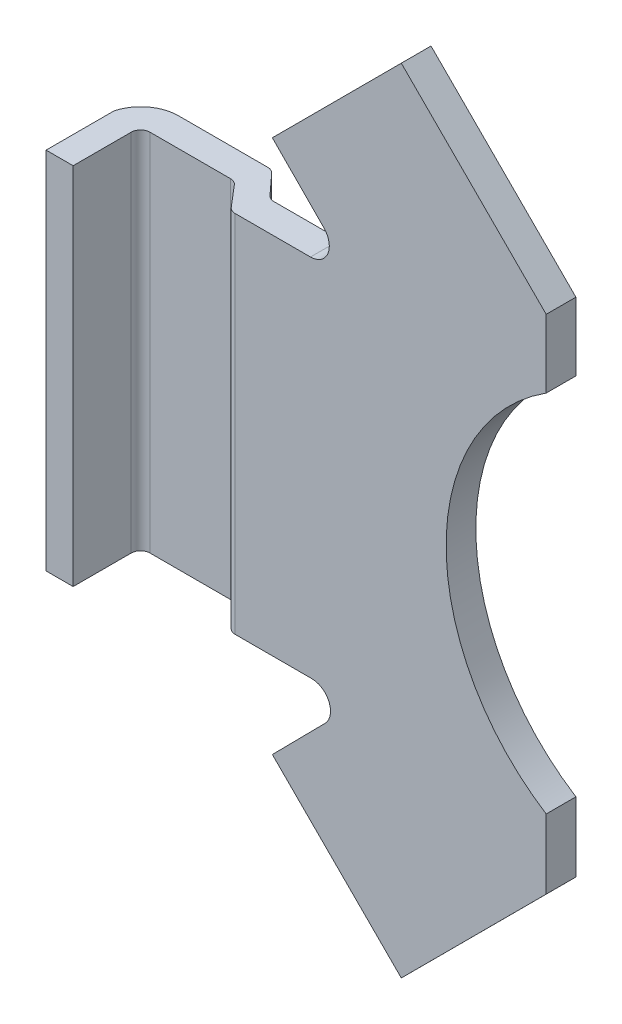
ISO-10303-21;
HEADER;
FILE_DESCRIPTION(('STEP AP214'),'2;1');
FILE_NAME('part.step','',(''),(''),'','','');
FILE_SCHEMA(('AUTOMOTIVE_DESIGN { 1 0 10303 214 1 1 1 1 }'));
ENDSEC;
DATA;
#1=APPLICATION_CONTEXT('core data for automotive mechanical design processes');
#2=APPLICATION_PROTOCOL_DEFINITION('international standard','automotive_design',2000,#1);
#3=PRODUCT_CONTEXT('',#1,'mechanical');
#4=PRODUCT('Part','Part','',(#3));
#5=PRODUCT_RELATED_PRODUCT_CATEGORY('part','',(#4));
#6=PRODUCT_DEFINITION_FORMATION('','',#4);
#7=PRODUCT_DEFINITION_CONTEXT('part definition',#1,'design');
#8=PRODUCT_DEFINITION('design','',#6,#7);
#9=PRODUCT_DEFINITION_SHAPE('','',#8);
#10=(LENGTH_UNIT() NAMED_UNIT(*) SI_UNIT(.MILLI.,.METRE.));
#11=(NAMED_UNIT(*) PLANE_ANGLE_UNIT() SI_UNIT($,.RADIAN.));
#12=(NAMED_UNIT(*) SI_UNIT($,.STERADIAN.) SOLID_ANGLE_UNIT());
#13=UNCERTAINTY_MEASURE_WITH_UNIT(LENGTH_MEASURE(1.E-05),#10,'distance_accuracy_value','');
#14=(GEOMETRIC_REPRESENTATION_CONTEXT(3) GLOBAL_UNCERTAINTY_ASSIGNED_CONTEXT((#13)) GLOBAL_UNIT_ASSIGNED_CONTEXT((#10,
#11,#12)) REPRESENTATION_CONTEXT('',''));
#15=CARTESIAN_POINT('',(0.,0.,0.));
#16=DIRECTION('',(0.,0.,1.));
#17=DIRECTION('',(1.,0.,0.));
#18=AXIS2_PLACEMENT_3D('',#15,#16,#17);
#19=CARTESIAN_POINT('',(-3.06833901407556,-0.000154619924073457,-1.));
#20=DIRECTION('',(-1.,0.,0.));
#21=DIRECTION('',(0.,-1.,0.));
#22=AXIS2_PLACEMENT_3D('',#19,#20,#21);
#23=PLANE('',#22);
#24=DIRECTION('',(0.,1.,0.));
#25=VECTOR('',#24,1.);
#26=CARTESIAN_POINT('',(-3.06833901407556,-4.99999999999999,0.509869098409825));
#27=LINE('',#26,#25);
#28=CARTESIAN_POINT('',(-3.06833901407556,0.968213768723652,0.509869098409825));
#29=VERTEX_POINT('',#28);
#30=CARTESIAN_POINT('',(-3.06833901407556,-0.9685230085718,0.509869098409825));
#31=VERTEX_POINT('',#30);
#32=EDGE_CURVE('E216',#29,#31,#27,.F.);
#33=ORIENTED_EDGE('',*,*,#32,.F.);
#34=DIRECTION('',(0.,0.,1.));
#35=VECTOR('',#34,1.);
#36=CARTESIAN_POINT('',(-3.06833901407556,0.968213768723652,-1.));
#37=LINE('',#36,#35);
#38=CARTESIAN_POINT('',(-3.06833901407556,0.968213768723652,0.149154975526047));
#39=VERTEX_POINT('',#38);
#40=EDGE_CURVE('E141',#29,#39,#37,.F.);
#41=ORIENTED_EDGE('',*,*,#40,.T.);
#42=DIRECTION('',(0.,1.,0.));
#43=VECTOR('',#42,1.);
#44=CARTESIAN_POINT('',(-3.06833901407555,-4.99999999999999,0.149154975526028));
#45=LINE('',#44,#43);
#46=CARTESIAN_POINT('',(-3.06833901407556,-0.9685230085718,0.149154975526047));
#47=VERTEX_POINT('',#46);
#48=EDGE_CURVE('E250',#47,#39,#45,.T.);
#49=ORIENTED_EDGE('',*,*,#48,.F.);
#50=DIRECTION('',(0.,0.,1.));
#51=VECTOR('',#50,1.);
#52=CARTESIAN_POINT('',(-3.06833901407556,-0.9685230085718,-1.));
#53=LINE('',#52,#51);
#54=EDGE_CURVE('E244',#47,#31,#53,.T.);
#55=ORIENTED_EDGE('',*,*,#54,.T.);
#56=EDGE_LOOP('',(#33,#41,#49,#55));
#57=FACE_BOUND('',#56,.T.);
#58=ADVANCED_FACE('F16',(#57),#23,.T.);
#59=CARTESIAN_POINT('',(-2.87491,-4.99999999999999,0.2));
#60=DIRECTION('',(0.,1.,0.));
#61=DIRECTION('',(0.,0.,1.));
#62=AXIS2_PLACEMENT_3D('',#59,#60,#61);
#63=CYLINDRICAL_SURFACE('',#62,0.2);
#64=CARTESIAN_POINT('',(-2.87491,0.968213768723652,0.2));
#65=DIRECTION('',(0.,1.,0.));
#66=DIRECTION('',(0.,0.,1.));
#67=AXIS2_PLACEMENT_3D('',#64,#65,#66);
#68=CIRCLE('',#67,0.2);
#69=CARTESIAN_POINT('',(-2.87491,0.968213768723652,0.));
#70=VERTEX_POINT('',#69);
#71=EDGE_CURVE('E217',#39,#70,#68,.F.);
#72=ORIENTED_EDGE('',*,*,#71,.T.);
#73=DIRECTION('',(0.,1.,0.));
#74=VECTOR('',#73,1.);
#75=CARTESIAN_POINT('',(-2.87491,-4.99999999999999,0.));
#76=LINE('',#75,#74);
#77=CARTESIAN_POINT('',(-2.87491,-0.9685230085718,0.));
#78=VERTEX_POINT('',#77);
#79=EDGE_CURVE('E237',#78,#70,#76,.T.);
#80=ORIENTED_EDGE('',*,*,#79,.F.);
#81=CARTESIAN_POINT('',(-2.87491,-0.9685230085718,0.2));
#82=DIRECTION('',(0.,1.,0.));
#83=DIRECTION('',(0.,0.,1.));
#84=AXIS2_PLACEMENT_3D('',#81,#82,#83);
#85=CIRCLE('',#84,0.2);
#86=EDGE_CURVE('E19',#78,#47,#85,.T.);
#87=ORIENTED_EDGE('',*,*,#86,.T.);
#88=ORIENTED_EDGE('',*,*,#48,.T.);
#89=EDGE_LOOP('',(#72,#80,#87,#88));
#90=FACE_BOUND('',#89,.T.);
#91=ADVANCED_FACE('F308',(#90),#63,.T.);
#92=CARTESIAN_POINT('',(-2.99979074452335,-4.99999999999999,0.509869098409825));
#93=DIRECTION('',(0.,0.,1.));
#94=DIRECTION('',(1.,0.,0.));
#95=AXIS2_PLACEMENT_3D('',#92,#93,#94);
#96=PLANE('',#95);
#97=DIRECTION('',(1.,0.,0.));
#98=VECTOR('',#97,1.);
#99=CARTESIAN_POINT('',(-2.99979074452335,0.968213768723652,0.509869098409825));
#100=LINE('',#99,#98);
#101=CARTESIAN_POINT('',(-2.92467148904669,0.968213768723652,0.509869098409825));
#102=VERTEX_POINT('',#101);
#103=EDGE_CURVE('E193',#102,#29,#100,.F.);
#104=ORIENTED_EDGE('',*,*,#103,.T.);
#105=ORIENTED_EDGE('',*,*,#32,.T.);
#106=DIRECTION('',(1.,0.,0.));
#107=VECTOR('',#106,1.);
#108=CARTESIAN_POINT('',(-2.99979074452335,-0.9685230085718,0.509869098409825));
#109=LINE('',#108,#107);
#110=CARTESIAN_POINT('',(-2.92467148904669,-0.9685230085718,0.509869098409825));
#111=VERTEX_POINT('',#110);
#112=EDGE_CURVE('E200',#31,#111,#109,.T.);
#113=ORIENTED_EDGE('',*,*,#112,.T.);
#114=DIRECTION('',(0.,1.,0.));
#115=VECTOR('',#114,1.);
#116=CARTESIAN_POINT('',(-2.92467148904669,-4.99999999999999,0.509869098409825));
#117=LINE('',#116,#115);
#118=EDGE_CURVE('E214',#102,#111,#117,.F.);
#119=ORIENTED_EDGE('',*,*,#118,.F.);
#120=EDGE_LOOP('',(#104,#105,#113,#119));
#121=FACE_BOUND('',#120,.T.);
#122=ADVANCED_FACE('F213',(#121),#96,.T.);
#123=CARTESIAN_POINT('',(-2.63745267856469,-4.99999999999999,0.));
#124=DIRECTION('',(0.,0.,-1.));
#125=DIRECTION('',(-1.,0.,0.));
#126=AXIS2_PLACEMENT_3D('',#123,#124,#125);
#127=PLANE('',#126);
#128=DIRECTION('',(-1.,0.,0.));
#129=VECTOR('',#128,1.);
#130=CARTESIAN_POINT('',(-2.63745267856469,0.968213768723652,0.));
#131=LINE('',#130,#129);
#132=CARTESIAN_POINT('',(-2.3999953571294,0.968213768723652,0.));
#133=VERTEX_POINT('',#132);
#134=EDGE_CURVE('E209',#70,#133,#131,.F.);
#135=ORIENTED_EDGE('',*,*,#134,.T.);
#136=DIRECTION('',(0.,1.,0.));
#137=VECTOR('',#136,1.);
#138=CARTESIAN_POINT('',(-2.3999953571294,-4.99999999999999,0.));
#139=LINE('',#138,#137);
#140=CARTESIAN_POINT('',(-2.3999953571294,-0.9685230085718,0.));
#141=VERTEX_POINT('',#140);
#142=EDGE_CURVE('E223',#141,#133,#139,.T.);
#143=ORIENTED_EDGE('',*,*,#142,.F.);
#144=DIRECTION('',(-1.,0.,0.));
#145=VECTOR('',#144,1.);
#146=CARTESIAN_POINT('',(-2.63745267856469,-0.9685230085718,0.));
#147=LINE('',#146,#145);
#148=EDGE_CURVE('E228',#141,#78,#147,.T.);
#149=ORIENTED_EDGE('',*,*,#148,.T.);
#150=ORIENTED_EDGE('',*,*,#79,.T.);
#151=EDGE_LOOP('',(#135,#143,#149,#150));
#152=FACE_BOUND('',#151,.T.);
#153=ADVANCED_FACE('F317',(#152),#127,.T.);
#154=CARTESIAN_POINT('',(-2.92467148904669,-4.99999999999999,0.355589549204912));
#155=DIRECTION('',(1.,0.,0.));
#156=DIRECTION('',(0.,0.,-1.));
#157=AXIS2_PLACEMENT_3D('',#154,#155,#156);
#158=PLANE('',#157);
#159=DIRECTION('',(0.,0.,-1.));
#160=VECTOR('',#159,1.);
#161=CARTESIAN_POINT('',(-2.92467148904669,0.968213768723652,0.355589549204912));
#162=LINE('',#161,#160);
#163=CARTESIAN_POINT('',(-2.92467148904671,0.968213768723652,0.20131));
#164=VERTEX_POINT('',#163);
#165=EDGE_CURVE('E208',#164,#102,#162,.F.);
#166=ORIENTED_EDGE('',*,*,#165,.T.);
#167=ORIENTED_EDGE('',*,*,#118,.T.);
#168=DIRECTION('',(0.,0.,-1.));
#169=VECTOR('',#168,1.);
#170=CARTESIAN_POINT('',(-2.92467148904669,-0.9685230085718,0.355589549204912));
#171=LINE('',#170,#169);
#172=CARTESIAN_POINT('',(-2.92467148904671,-0.9685230085718,0.20131));
#173=VERTEX_POINT('',#172);
#174=EDGE_CURVE('E197',#111,#173,#171,.T.);
#175=ORIENTED_EDGE('',*,*,#174,.T.);
#176=DIRECTION('',(0.,1.,0.));
#177=VECTOR('',#176,1.);
#178=CARTESIAN_POINT('',(-2.92467148904672,-4.99999999999999,0.20131));
#179=LINE('',#178,#177);
#180=EDGE_CURVE('E304',#173,#164,#179,.T.);
#181=ORIENTED_EDGE('',*,*,#180,.T.);
#182=EDGE_LOOP('',(#166,#167,#175,#181));
#183=FACE_BOUND('',#182,.T.);
#184=ADVANCED_FACE('F219',(#183),#158,.T.);
#185=CARTESIAN_POINT('',(-2.3999953571294,-4.99999999999999,0.0500000000000007));
#186=DIRECTION('',(0.,1.,0.));
#187=DIRECTION('',(0.,0.,1.));
#188=AXIS2_PLACEMENT_3D('',#185,#186,#187);
#189=CYLINDRICAL_SURFACE('',#188,0.0500000000000007);
#190=CARTESIAN_POINT('',(-2.3999953571294,0.968213768723652,0.0500000000000007));
#191=DIRECTION('',(0.,1.,0.));
#192=DIRECTION('',(0.,0.,1.));
#193=AXIS2_PLACEMENT_3D('',#190,#191,#192);
#194=CIRCLE('',#193,0.0500000000000007);
#195=CARTESIAN_POINT('',(-2.36309722458586,0.968213768723652,0.0162579221920218));
#196=VERTEX_POINT('',#195);
#197=EDGE_CURVE('E305',#133,#196,#194,.F.);
#198=ORIENTED_EDGE('',*,*,#197,.T.);
#199=DIRECTION('',(0.,1.,0.));
#200=VECTOR('',#199,1.);
#201=CARTESIAN_POINT('',(-2.36309722458586,-4.99999999999999,0.016257922192022));
#202=LINE('',#201,#200);
#203=CARTESIAN_POINT('',(-2.36309722458586,-0.9685230085718,0.0162579221920218));
#204=VERTEX_POINT('',#203);
#205=EDGE_CURVE('E323',#204,#196,#202,.T.);
#206=ORIENTED_EDGE('',*,*,#205,.F.);
#207=CARTESIAN_POINT('',(-2.3999953571294,-0.9685230085718,0.0500000000000007));
#208=DIRECTION('',(0.,1.,0.));
#209=DIRECTION('',(0.,0.,1.));
#210=AXIS2_PLACEMENT_3D('',#207,#208,#209);
#211=CIRCLE('',#210,0.0500000000000007);
#212=EDGE_CURVE('E220',#204,#141,#211,.T.);
#213=ORIENTED_EDGE('',*,*,#212,.T.);
#214=ORIENTED_EDGE('',*,*,#142,.T.);
#215=EDGE_LOOP('',(#198,#206,#213,#214));
#216=FACE_BOUND('',#215,.T.);
#217=ADVANCED_FACE('F324',(#216),#189,.T.);
#218=CARTESIAN_POINT('',(-2.87467148904672,-4.99999999999999,0.20131));
#219=DIRECTION('',(0.,1.,0.));
#220=DIRECTION('',(0.,0.,1.));
#221=AXIS2_PLACEMENT_3D('',#218,#219,#220);
#222=CYLINDRICAL_SURFACE('',#221,0.0500000000000007);
#223=DIRECTION('',(0.,1.,0.));
#224=VECTOR('',#223,1.);
#225=CARTESIAN_POINT('',(-2.87467148904672,-4.99999999999999,0.151309999999999));
#226=LINE('',#225,#224);
#227=CARTESIAN_POINT('',(-2.87467148904672,0.968213768723652,0.151309999999999));
#228=VERTEX_POINT('',#227);
#229=CARTESIAN_POINT('',(-2.87467148904672,-0.9685230085718,0.151309999999999));
#230=VERTEX_POINT('',#229);
#231=EDGE_CURVE('E299',#228,#230,#226,.F.);
#232=ORIENTED_EDGE('',*,*,#231,.F.);
#233=CARTESIAN_POINT('',(-2.87467148904672,0.968213768723652,0.20131));
#234=DIRECTION('',(0.,1.,0.));
#235=DIRECTION('',(0.,0.,1.));
#236=AXIS2_PLACEMENT_3D('',#233,#234,#235);
#237=CIRCLE('',#236,0.0500000000000007);
#238=EDGE_CURVE('E302',#164,#228,#237,.F.);
#239=ORIENTED_EDGE('',*,*,#238,.F.);
#240=ORIENTED_EDGE('',*,*,#180,.F.);
#241=CARTESIAN_POINT('',(-2.87467148904672,-0.9685230085718,0.20131));
#242=DIRECTION('',(0.,1.,0.));
#243=DIRECTION('',(0.,0.,1.));
#244=AXIS2_PLACEMENT_3D('',#241,#242,#243);
#245=CIRCLE('',#244,0.0500000000000007);
#246=EDGE_CURVE('E203',#230,#173,#245,.T.);
#247=ORIENTED_EDGE('',*,*,#246,.F.);
#248=EDGE_LOOP('',(#232,#239,#240,#247));
#249=FACE_BOUND('',#248,.T.);
#250=ADVANCED_FACE('F349',(#249),#222,.F.);
#251=CARTESIAN_POINT('',(-2.31328894837563,-4.99999999999999,0.0707250000000001));
#252=DIRECTION('',(0.737962650870705,0.,-0.674841556159579));
#253=DIRECTION('',(-0.674841556159579,0.,-0.737962650870705));
#254=AXIS2_PLACEMENT_3D('',#251,#252,#253);
#255=PLANE('',#254);
#256=DIRECTION('',(-0.674841556159579,0.,-0.737962650870705));
#257=VECTOR('',#256,1.);
#258=CARTESIAN_POINT('',(-2.31328894837563,0.968213768723652,0.0707250000000001));
#259=LINE('',#258,#257);
#260=CARTESIAN_POINT('',(-2.2634806721654,0.968213768723652,0.125192077807979));
#261=VERTEX_POINT('',#260);
#262=EDGE_CURVE('E327',#196,#261,#259,.F.);
#263=ORIENTED_EDGE('',*,*,#262,.T.);
#264=DIRECTION('',(0.,1.,0.));
#265=VECTOR('',#264,1.);
#266=CARTESIAN_POINT('',(-2.2634806721654,-4.99999999999999,0.125192077807979));
#267=LINE('',#266,#265);
#268=CARTESIAN_POINT('',(-2.2634806721654,-0.9685230085718,0.125192077807979));
#269=VERTEX_POINT('',#268);
#270=EDGE_CURVE('E296',#261,#269,#267,.F.);
#271=ORIENTED_EDGE('',*,*,#270,.T.);
#272=DIRECTION('',(-0.674841556159579,0.,-0.737962650870705));
#273=VECTOR('',#272,1.);
#274=CARTESIAN_POINT('',(-2.31328894837563,-0.9685230085718,0.0707250000000001));
#275=LINE('',#274,#273);
#276=EDGE_CURVE('E301',#269,#204,#275,.T.);
#277=ORIENTED_EDGE('',*,*,#276,.T.);
#278=ORIENTED_EDGE('',*,*,#205,.T.);
#279=EDGE_LOOP('',(#263,#271,#277,#278));
#280=FACE_BOUND('',#279,.T.);
#281=ADVANCED_FACE('F329',(#280),#255,.T.);
#282=CARTESIAN_POINT('',(-2.66089729114613,-4.99999999999999,0.151309999999999));
#283=DIRECTION('',(0.,0.,1.));
#284=DIRECTION('',(1.,0.,0.));
#285=AXIS2_PLACEMENT_3D('',#282,#283,#284);
#286=PLANE('',#285);
#287=DIRECTION('',(1.,0.,0.));
#288=VECTOR('',#287,1.);
#289=CARTESIAN_POINT('',(-2.66089729114613,0.968213768723652,0.151309999999999));
#290=LINE('',#289,#288);
#291=CARTESIAN_POINT('',(-2.44712309324554,0.968213768723652,0.151309999999999));
#292=VERTEX_POINT('',#291);
#293=EDGE_CURVE('E339',#292,#228,#290,.F.);
#294=ORIENTED_EDGE('',*,*,#293,.T.);
#295=ORIENTED_EDGE('',*,*,#231,.T.);
#296=DIRECTION('',(1.,0.,0.));
#297=VECTOR('',#296,1.);
#298=CARTESIAN_POINT('',(-2.66089729114613,-0.9685230085718,0.151309999999999));
#299=LINE('',#298,#297);
#300=CARTESIAN_POINT('',(-2.44712309324554,-0.9685230085718,0.151309999999999));
#301=VERTEX_POINT('',#300);
#302=EDGE_CURVE('E337',#230,#301,#299,.T.);
#303=ORIENTED_EDGE('',*,*,#302,.T.);
#304=DIRECTION('',(0.,1.,0.));
#305=VECTOR('',#304,1.);
#306=CARTESIAN_POINT('',(-2.44712309324554,-4.99999999999999,0.151309999999999));
#307=LINE('',#306,#305);
#308=EDGE_CURVE('E293',#301,#292,#307,.T.);
#309=ORIENTED_EDGE('',*,*,#308,.T.);
#310=EDGE_LOOP('',(#294,#295,#303,#309));
#311=FACE_BOUND('',#310,.T.);
#312=ADVANCED_FACE('F356',(#311),#286,.T.);
#313=CARTESIAN_POINT('',(-2.22658253962187,-4.99999999999999,0.0914499999999999));
#314=DIRECTION('',(0.,1.,0.));
#315=DIRECTION('',(0.,0.,1.));
#316=AXIS2_PLACEMENT_3D('',#313,#314,#315);
#317=CYLINDRICAL_SURFACE('',#316,0.0500000000000007);
#318=ORIENTED_EDGE('',*,*,#270,.F.);
#319=CARTESIAN_POINT('',(-2.22658253962187,0.968213768723652,0.0914499999999999));
#320=DIRECTION('',(0.,1.,0.));
#321=DIRECTION('',(0.,0.,1.));
#322=AXIS2_PLACEMENT_3D('',#319,#320,#321);
#323=CIRCLE('',#322,0.0500000000000007);
#324=CARTESIAN_POINT('',(-2.22658253962187,0.968213768723652,0.141450000000001));
#325=VERTEX_POINT('',#324);
#326=EDGE_CURVE('E297',#325,#261,#323,.F.);
#327=ORIENTED_EDGE('',*,*,#326,.F.);
#328=DIRECTION('',(0.,1.,0.));
#329=VECTOR('',#328,1.);
#330=CARTESIAN_POINT('',(-2.22658253962187,-4.99999999999999,0.141450000000001));
#331=LINE('',#330,#329);
#332=CARTESIAN_POINT('',(-2.22658253962187,-0.9685230085718,0.141450000000001));
#333=VERTEX_POINT('',#332);
#334=EDGE_CURVE('E290',#333,#325,#331,.T.);
#335=ORIENTED_EDGE('',*,*,#334,.F.);
#336=CARTESIAN_POINT('',(-2.22658253962187,-0.9685230085718,0.0914499999999999));
#337=DIRECTION('',(0.,1.,0.));
#338=DIRECTION('',(0.,0.,1.));
#339=AXIS2_PLACEMENT_3D('',#336,#337,#338);
#340=CIRCLE('',#339,0.0500000000000007);
#341=EDGE_CURVE('E294',#269,#333,#340,.T.);
#342=ORIENTED_EDGE('',*,*,#341,.F.);
#343=EDGE_LOOP('',(#318,#327,#335,#342));
#344=FACE_BOUND('',#343,.T.);
#345=ADVANCED_FACE('F523',(#344),#317,.F.);
#346=CARTESIAN_POINT('',(-2.44712309324554,-4.99999999999999,0.20131));
#347=DIRECTION('',(0.,1.,0.));
#348=DIRECTION('',(0.,0.,1.));
#349=AXIS2_PLACEMENT_3D('',#346,#347,#348);
#350=CYLINDRICAL_SURFACE('',#349,0.0500000000000009);
#351=DIRECTION('',(0.,1.,0.));
#352=VECTOR('',#351,1.);
#353=CARTESIAN_POINT('',(-2.4091071287639,-4.99999999999999,0.168832524043111));
#354=LINE('',#353,#352);
#355=CARTESIAN_POINT('',(-2.4091071287639,0.968213768723652,0.168832524043112));
#356=VERTEX_POINT('',#355);
#357=CARTESIAN_POINT('',(-2.4091071287639,-0.9685230085718,0.168832524043111));
#358=VERTEX_POINT('',#357);
#359=EDGE_CURVE('E361',#356,#358,#354,.F.);
#360=ORIENTED_EDGE('',*,*,#359,.F.);
#361=CARTESIAN_POINT('',(-2.44712309324554,0.968213768723652,0.20131));
#362=DIRECTION('',(0.,1.,0.));
#363=DIRECTION('',(0.,0.,1.));
#364=AXIS2_PLACEMENT_3D('',#361,#362,#363);
#365=CIRCLE('',#364,0.0500000000000009);
#366=EDGE_CURVE('E291',#292,#356,#365,.F.);
#367=ORIENTED_EDGE('',*,*,#366,.F.);
#368=ORIENTED_EDGE('',*,*,#308,.F.);
#369=CARTESIAN_POINT('',(-2.44712309324554,-0.9685230085718,0.20131));
#370=DIRECTION('',(0.,1.,0.));
#371=DIRECTION('',(0.,0.,1.));
#372=AXIS2_PLACEMENT_3D('',#369,#370,#371);
#373=CIRCLE('',#372,0.0500000000000009);
#374=EDGE_CURVE('E287',#358,#301,#373,.T.);
#375=ORIENTED_EDGE('',*,*,#374,.F.);
#376=EDGE_LOOP('',(#360,#367,#368,#375));
#377=FACE_BOUND('',#376,.T.);
#378=ADVANCED_FACE('F359',(#377),#350,.F.);
#379=CARTESIAN_POINT('',(-1.4178424885196,-4.99999999999999,0.141450000000001));
#380=DIRECTION('',(0.,0.,-1.));
#381=DIRECTION('',(-1.,0.,0.));
#382=AXIS2_PLACEMENT_3D('',#379,#380,#381);
#383=PLANE('',#382);
#384=DIRECTION('',(-0.702621696272423,-0.711563596544443,0.));
#385=VECTOR('',#384,1.);
#386=CARTESIAN_POINT('',(-1.93647797721502,-1.28064062403269,0.141450000000001));
#387=LINE('',#386,#385);
#388=CARTESIAN_POINT('',(-1.79640516508531,-1.13878517819904,0.141450000000001));
#389=VERTEX_POINT('',#388);
#390=CARTESIAN_POINT('',(-2.07655078934474,-1.42249606986633,0.141450000000001));
#391=VERTEX_POINT('',#390);
#392=EDGE_CURVE('E281',#389,#391,#387,.T.);
#393=ORIENTED_EDGE('',*,*,#392,.F.);
#394=CARTESIAN_POINT('',(-1.86756152473975,-1.0685230085718,0.141450000000001));
#395=DIRECTION('',(0.,0.,1.));
#396=DIRECTION('',(1.,0.,0.));
#397=AXIS2_PLACEMENT_3D('',#394,#395,#396);
#398=CIRCLE('',#397,0.099999999999999);
#399=CARTESIAN_POINT('',(-1.86756152473975,-0.9685230085718,0.141450000000001));
#400=VERTEX_POINT('',#399);
#401=EDGE_CURVE('E278',#389,#400,#398,.T.);
#402=ORIENTED_EDGE('',*,*,#401,.T.);
#403=DIRECTION('',(1.,0.,0.));
#404=VECTOR('',#403,1.);
#405=CARTESIAN_POINT('',(-2.46795026940765,-0.9685230085718,0.141450000000001));
#406=LINE('',#405,#404);
#407=EDGE_CURVE('E365',#333,#400,#406,.T.);
#408=ORIENTED_EDGE('',*,*,#407,.F.);
#409=ORIENTED_EDGE('',*,*,#334,.T.);
#410=DIRECTION('',(-1.,0.,0.));
#411=VECTOR('',#410,1.);
#412=CARTESIAN_POINT('',(-1.4178424885196,0.968213768723652,0.141450000000001));
#413=LINE('',#412,#411);
#414=CARTESIAN_POINT('',(-1.87402009009515,0.968213768723652,0.141450000000001));
#415=VERTEX_POINT('',#414);
#416=EDGE_CURVE('E286',#325,#415,#413,.F.);
#417=ORIENTED_EDGE('',*,*,#416,.T.);
#418=CARTESIAN_POINT('',(-1.87402009009515,1.06821376872365,0.141450000000001));
#419=DIRECTION('',(0.,0.,1.));
#420=DIRECTION('',(1.,0.,0.));
#421=AXIS2_PLACEMENT_3D('',#418,#419,#420);
#422=CIRCLE('',#421,0.0999999999999988);
#423=CARTESIAN_POINT('',(-1.8028637304407,1.13847593835089,0.141450000000001));
#424=VERTEX_POINT('',#423);
#425=EDGE_CURVE('E282',#415,#424,#422,.T.);
#426=ORIENTED_EDGE('',*,*,#425,.T.);
#427=DIRECTION('',(-0.702621696272423,0.711563596544443,0.));
#428=VECTOR('',#427,1.);
#429=CARTESIAN_POINT('',(-1.8028637304407,1.13847593835089,0.141450000000001));
#430=LINE('',#429,#428);
#431=CARTESIAN_POINT('',(-2.07655639819004,1.41565175009249,0.141450000000001));
#432=VERTEX_POINT('',#431);
#433=EDGE_CURVE('E285',#424,#432,#430,.T.);
#434=ORIENTED_EDGE('',*,*,#433,.T.);
#435=DIRECTION('',(0.706722946021185,0.707490408109634,0.));
#436=VECTOR('',#435,1.);
#437=CARTESIAN_POINT('',(-2.07655639819004,1.41565175009249,0.141450000000001));
#438=LINE('',#437,#436);
#439=CARTESIAN_POINT('',(-1.39143709676047,2.10151505324561,0.141450000000001));
#440=VERTEX_POINT('',#439);
#441=EDGE_CURVE('E446',#432,#440,#438,.T.);
#442=ORIENTED_EDGE('',*,*,#441,.T.);
#443=DIRECTION('',(0.706722946021185,-0.707490408109635,0.));
#444=VECTOR('',#443,1.);
#445=CARTESIAN_POINT('',(-1.39143709676047,2.10151505324561,0.141450000000001));
#446=LINE('',#445,#444);
#447=CARTESIAN_POINT('',(-0.621497695036036,1.33073953985316,0.141450000000001));
#448=VERTEX_POINT('',#447);
#449=EDGE_CURVE('E441',#440,#448,#446,.T.);
#450=ORIENTED_EDGE('',*,*,#449,.T.);
#451=DIRECTION('',(0.,1.,0.));
#452=VECTOR('',#451,1.);
#453=CARTESIAN_POINT('',(-0.621497695036035,-4.99999999999999,0.141450000000001));
#454=LINE('',#453,#452);
#455=CARTESIAN_POINT('',(-0.621497695036035,0.968213768723652,0.141450000000001));
#456=VERTEX_POINT('',#455);
#457=EDGE_CURVE('E366',#448,#456,#454,.F.);
#458=ORIENTED_EDGE('',*,*,#457,.T.);
#459=CARTESIAN_POINT('',(-0.00569141172034986,-0.000154619924074867,0.141450000000001));
#460=DIRECTION('',(0.,0.,1.));
#461=DIRECTION('',(1.,0.,0.));
#462=AXIS2_PLACEMENT_3D('',#459,#460,#461);
#463=CIRCLE('',#462,1.14758647373663);
#464=CARTESIAN_POINT('',(-0.621497695036036,-0.968523008571802,0.141450000000001));
#465=VERTEX_POINT('',#464);
#466=EDGE_CURVE('E273',#456,#465,#463,.T.);
#467=ORIENTED_EDGE('',*,*,#466,.T.);
#468=DIRECTION('',(0.,1.,0.));
#469=VECTOR('',#468,1.);
#470=CARTESIAN_POINT('',(-0.621497695036035,-1.15305189207466,0.141450000000001));
#471=LINE('',#470,#469);
#472=CARTESIAN_POINT('',(-0.621497695036036,-1.33758077557753,0.141450000000001));
#473=VERTEX_POINT('',#472);
#474=EDGE_CURVE('E411',#473,#465,#471,.T.);
#475=ORIENTED_EDGE('',*,*,#474,.F.);
#476=DIRECTION('',(0.706722946021183,0.707490408109636,0.));
#477=VECTOR('',#476,1.);
#478=CARTESIAN_POINT('',(-1.00646676386293,-1.72296789955207,0.141450000000001));
#479=LINE('',#478,#477);
#480=CARTESIAN_POINT('',(-1.39143583268982,-2.10835502352662,0.141450000000001));
#481=VERTEX_POINT('',#480);
#482=EDGE_CURVE('E423',#481,#473,#479,.T.);
#483=ORIENTED_EDGE('',*,*,#482,.F.);
#484=DIRECTION('',(0.706722946021184,-0.707490408109635,0.));
#485=VECTOR('',#484,1.);
#486=CARTESIAN_POINT('',(-1.73399331101728,-1.76542554669648,0.141450000000001));
#487=LINE('',#486,#485);
#488=EDGE_CURVE('E431',#391,#481,#487,.T.);
#489=ORIENTED_EDGE('',*,*,#488,.F.);
#490=EDGE_LOOP('',(#393,#402,#408,#409,#417,#426,#434,#442,#450,#458,#467,#475,#483,#489));
#491=FACE_BOUND('',#490,.T.);
#492=ADVANCED_FACE('F476',(#491),#383,.T.);
#493=CARTESIAN_POINT('',(-2.36084495641994,-4.99999999999999,0.225324999999999));
#494=DIRECTION('',(-0.760319289632921,0.,0.649549519137756));
#495=DIRECTION('',(0.649549519137756,0.,0.760319289632921));
#496=AXIS2_PLACEMENT_3D('',#493,#494,#495);
#497=PLANE('',#496);
#498=DIRECTION('',(0.64954951913775,0.,0.760319289632926));
#499=VECTOR('',#498,1.);
#500=CARTESIAN_POINT('',(-2.4091071287639,0.968213768723652,0.168832524043111));
#501=LINE('',#500,#499);
#502=CARTESIAN_POINT('',(-2.31258278407599,0.968213768723652,0.281817475956887));
#503=VERTEX_POINT('',#502);
#504=EDGE_CURVE('E369',#356,#503,#501,.T.);
#505=ORIENTED_EDGE('',*,*,#504,.F.);
#506=ORIENTED_EDGE('',*,*,#359,.T.);
#507=DIRECTION('',(-0.64954951913776,0.,-0.760319289632918));
#508=VECTOR('',#507,1.);
#509=CARTESIAN_POINT('',(-2.31258278407599,-0.9685230085718,0.281817475956888));
#510=LINE('',#509,#508);
#511=CARTESIAN_POINT('',(-2.31258278407599,-0.9685230085718,0.281817475956886));
#512=VERTEX_POINT('',#511);
#513=EDGE_CURVE('E436',#512,#358,#510,.T.);
#514=ORIENTED_EDGE('',*,*,#513,.F.);
#515=DIRECTION('',(0.,1.,0.));
#516=VECTOR('',#515,1.);
#517=CARTESIAN_POINT('',(-2.31258278407599,-4.99999999999999,0.281817475956886));
#518=LINE('',#517,#516);
#519=EDGE_CURVE('E268',#503,#512,#518,.F.);
#520=ORIENTED_EDGE('',*,*,#519,.F.);
#521=EDGE_LOOP('',(#505,#506,#514,#520));
#522=FACE_BOUND('',#521,.T.);
#523=ADVANCED_FACE('F370',(#522),#497,.T.);
#524=CARTESIAN_POINT('',(-2.46795026940765,-0.9685230085718,-1.));
#525=DIRECTION('',(0.,-1.,0.));
#526=DIRECTION('',(1.,0.,0.));
#527=AXIS2_PLACEMENT_3D('',#524,#525,#526);
#528=PLANE('',#527);
#529=ORIENTED_EDGE('',*,*,#276,.F.);
#530=ORIENTED_EDGE('',*,*,#341,.T.);
#531=ORIENTED_EDGE('',*,*,#407,.T.);
#532=DIRECTION('',(0.,0.,1.));
#533=VECTOR('',#532,1.);
#534=CARTESIAN_POINT('',(-1.86756152473975,-0.9685230085718,-1.));
#535=LINE('',#534,#533);
#536=CARTESIAN_POINT('',(-1.86756152473975,-0.9685230085718,0.299339999999999));
#537=VERTEX_POINT('',#536);
#538=EDGE_CURVE('E160',#400,#537,#535,.T.);
#539=ORIENTED_EDGE('',*,*,#538,.T.);
#540=DIRECTION('',(1.,0.,0.));
#541=VECTOR('',#540,1.);
#542=CARTESIAN_POINT('',(-1.44183462850583,-0.9685230085718,0.299339999999999));
#543=LINE('',#542,#541);
#544=CARTESIAN_POINT('',(-2.27456681959434,-0.9685230085718,0.299339999999999));
#545=VERTEX_POINT('',#544);
#546=EDGE_CURVE('E266',#545,#537,#543,.T.);
#547=ORIENTED_EDGE('',*,*,#546,.F.);
#548=CARTESIAN_POINT('',(-2.27456681959434,-0.9685230085718,0.249339999999998));
#549=DIRECTION('',(0.,1.,0.));
#550=DIRECTION('',(0.,0.,1.));
#551=AXIS2_PLACEMENT_3D('',#548,#549,#550);
#552=CIRCLE('',#551,0.0500000000000007);
#553=EDGE_CURVE('E269',#512,#545,#552,.T.);
#554=ORIENTED_EDGE('',*,*,#553,.F.);
#555=ORIENTED_EDGE('',*,*,#513,.T.);
#556=ORIENTED_EDGE('',*,*,#374,.T.);
#557=ORIENTED_EDGE('',*,*,#302,.F.);
#558=ORIENTED_EDGE('',*,*,#246,.T.);
#559=ORIENTED_EDGE('',*,*,#174,.F.);
#560=ORIENTED_EDGE('',*,*,#112,.F.);
#561=ORIENTED_EDGE('',*,*,#54,.F.);
#562=ORIENTED_EDGE('',*,*,#86,.F.);
#563=ORIENTED_EDGE('',*,*,#148,.F.);
#564=ORIENTED_EDGE('',*,*,#212,.F.);
#565=EDGE_LOOP('',(#529,#530,#531,#539,#547,#554,#555,#556,#557,#558,#559,#560,#561,#562,#563,#564));
#566=FACE_BOUND('',#565,.T.);
#567=ADVANCED_FACE('F199',(#566),#528,.T.);
#568=CARTESIAN_POINT('',(-1.86756152473975,-1.0685230085718,-1.));
#569=DIRECTION('',(0.,0.,1.));
#570=DIRECTION('',(1.,0.,0.));
#571=AXIS2_PLACEMENT_3D('',#568,#569,#570);
#572=CYLINDRICAL_SURFACE('',#571,0.099999999999999);
#573=DIRECTION('',(0.,0.,1.));
#574=VECTOR('',#573,1.);
#575=CARTESIAN_POINT('',(-1.79640516508531,-1.13878517819904,-1.));
#576=LINE('',#575,#574);
#577=CARTESIAN_POINT('',(-1.79640516508531,-1.13878517819904,0.299339999999999));
#578=VERTEX_POINT('',#577);
#579=EDGE_CURVE('E167',#578,#389,#576,.F.);
#580=ORIENTED_EDGE('',*,*,#579,.F.);
#581=CARTESIAN_POINT('',(-1.86756152473975,-1.0685230085718,0.299339999999999));
#582=DIRECTION('',(0.,0.,1.));
#583=DIRECTION('',(1.,0.,0.));
#584=AXIS2_PLACEMENT_3D('',#581,#582,#583);
#585=CIRCLE('',#584,0.099999999999999);
#586=EDGE_CURVE('E262',#537,#578,#585,.F.);
#587=ORIENTED_EDGE('',*,*,#586,.F.);
#588=ORIENTED_EDGE('',*,*,#538,.F.);
#589=ORIENTED_EDGE('',*,*,#401,.F.);
#590=EDGE_LOOP('',(#580,#587,#588,#589));
#591=FACE_BOUND('',#590,.T.);
#592=ADVANCED_FACE('F519',(#591),#572,.F.);
#593=CARTESIAN_POINT('',(-1.93647797721502,-1.28064062403269,-1.));
#594=DIRECTION('',(-0.711563596544443,0.702621696272423,0.));
#595=DIRECTION('',(-0.702621696272423,-0.711563596544443,0.));
#596=AXIS2_PLACEMENT_3D('',#593,#594,#595);
#597=PLANE('',#596);
#598=DIRECTION('',(-0.702621696272423,-0.711563596544443,0.));
#599=VECTOR('',#598,1.);
#600=CARTESIAN_POINT('',(-1.79640516508531,-1.13878517819904,0.299339999999999));
#601=LINE('',#600,#599);
#602=CARTESIAN_POINT('',(-2.07655078934474,-1.42249606986633,0.299339999999999));
#603=VERTEX_POINT('',#602);
#604=EDGE_CURVE('E265',#578,#603,#601,.T.);
#605=ORIENTED_EDGE('',*,*,#604,.F.);
#606=ORIENTED_EDGE('',*,*,#579,.T.);
#607=ORIENTED_EDGE('',*,*,#392,.T.);
#608=DIRECTION('',(0.,0.,1.));
#609=VECTOR('',#608,1.);
#610=CARTESIAN_POINT('',(-2.07655078934474,-1.42249606986633,-1.));
#611=LINE('',#610,#609);
#612=EDGE_CURVE('E175',#603,#391,#611,.F.);
#613=ORIENTED_EDGE('',*,*,#612,.F.);
#614=EDGE_LOOP('',(#605,#606,#607,#613));
#615=FACE_BOUND('',#614,.T.);
#616=ADVANCED_FACE('F516',(#615),#597,.T.);
#617=CARTESIAN_POINT('',(-1.73399331101728,-1.76542554669648,-1.));
#618=DIRECTION('',(-0.707490408109635,-0.706722946021184,0.));
#619=DIRECTION('',(0.706722946021184,-0.707490408109635,0.));
#620=AXIS2_PLACEMENT_3D('',#617,#618,#619);
#621=PLANE('',#620);
#622=DIRECTION('',(0.706722946021184,-0.707490408109635,0.));
#623=VECTOR('',#622,1.);
#624=CARTESIAN_POINT('',(-2.07655078934474,-1.42249606986633,0.299339999999999));
#625=LINE('',#624,#623);
#626=CARTESIAN_POINT('',(-1.39143583268982,-2.10835502352662,0.299339999999999));
#627=VERTEX_POINT('',#626);
#628=EDGE_CURVE('E417',#603,#627,#625,.T.);
#629=ORIENTED_EDGE('',*,*,#628,.F.);
#630=ORIENTED_EDGE('',*,*,#612,.T.);
#631=ORIENTED_EDGE('',*,*,#488,.T.);
#632=DIRECTION('',(0.,0.,1.));
#633=VECTOR('',#632,1.);
#634=CARTESIAN_POINT('',(-1.39143583268982,-2.10835502352662,-1.));
#635=LINE('',#634,#633);
#636=EDGE_CURVE('E420',#627,#481,#635,.F.);
#637=ORIENTED_EDGE('',*,*,#636,.F.);
#638=EDGE_LOOP('',(#629,#630,#631,#637));
#639=FACE_BOUND('',#638,.T.);
#640=ADVANCED_FACE('F514',(#639),#621,.T.);
#641=CARTESIAN_POINT('',(-1.00646676386293,-1.72296789955207,-1.));
#642=DIRECTION('',(0.707490408109636,-0.706722946021183,0.));
#643=DIRECTION('',(0.706722946021183,0.707490408109636,0.));
#644=AXIS2_PLACEMENT_3D('',#641,#642,#643);
#645=PLANE('',#644);
#646=DIRECTION('',(0.706722946021183,0.707490408109637,0.));
#647=VECTOR('',#646,1.);
#648=CARTESIAN_POINT('',(-1.39143583268982,-2.10835502352662,0.299339999999999));
#649=LINE('',#648,#647);
#650=CARTESIAN_POINT('',(-0.621497695036036,-1.33758077557753,0.299339999999999));
#651=VERTEX_POINT('',#650);
#652=EDGE_CURVE('E414',#627,#651,#649,.T.);
#653=ORIENTED_EDGE('',*,*,#652,.F.);
#654=ORIENTED_EDGE('',*,*,#636,.T.);
#655=ORIENTED_EDGE('',*,*,#482,.T.);
#656=DIRECTION('',(0.,0.,1.));
#657=VECTOR('',#656,1.);
#658=CARTESIAN_POINT('',(-0.621497695036036,-1.33758077557753,-1.));
#659=LINE('',#658,#657);
#660=EDGE_CURVE('E408',#651,#473,#659,.F.);
#661=ORIENTED_EDGE('',*,*,#660,.F.);
#662=EDGE_LOOP('',(#653,#654,#655,#661));
#663=FACE_BOUND('',#662,.T.);
#664=ADVANCED_FACE('F505',(#663),#645,.T.);
#665=CARTESIAN_POINT('',(-0.621497695036035,-1.15305189207466,-1.));
#666=DIRECTION('',(1.,0.,0.));
#667=DIRECTION('',(0.,1.,0.));
#668=AXIS2_PLACEMENT_3D('',#665,#666,#667);
#669=PLANE('',#668);
#670=DIRECTION('',(0.,1.,0.));
#671=VECTOR('',#670,1.);
#672=CARTESIAN_POINT('',(-0.621497695036035,-4.99999999999999,0.299339999999999));
#673=LINE('',#672,#671);
#674=CARTESIAN_POINT('',(-0.621497695036036,-0.968523008571802,0.299339999999999));
#675=VERTEX_POINT('',#674);
#676=EDGE_CURVE('E261',#651,#675,#673,.T.);
#677=ORIENTED_EDGE('',*,*,#676,.F.);
#678=ORIENTED_EDGE('',*,*,#660,.T.);
#679=ORIENTED_EDGE('',*,*,#474,.T.);
#680=DIRECTION('',(0.,0.,1.));
#681=VECTOR('',#680,1.);
#682=CARTESIAN_POINT('',(-0.621497695036036,-0.968523008571801,-1.));
#683=LINE('',#682,#681);
#684=EDGE_CURVE('E277',#465,#675,#683,.T.);
#685=ORIENTED_EDGE('',*,*,#684,.T.);
#686=EDGE_LOOP('',(#677,#678,#679,#685));
#687=FACE_BOUND('',#686,.T.);
#688=ADVANCED_FACE('F508',(#687),#669,.T.);
#689=CARTESIAN_POINT('',(-0.00569141172034986,-0.000154619924074867,-1.));
#690=DIRECTION('',(0.,0.,1.));
#691=DIRECTION('',(1.,0.,0.));
#692=AXIS2_PLACEMENT_3D('',#689,#690,#691);
#693=CYLINDRICAL_SURFACE('',#692,1.14758647373663);
#694=DIRECTION('',(0.,0.,1.));
#695=VECTOR('',#694,1.);
#696=CARTESIAN_POINT('',(-0.621497695036035,0.968213768723652,-1.));
#697=LINE('',#696,#695);
#698=CARTESIAN_POINT('',(-0.621497695036034,0.968213768723653,0.299339999999999));
#699=VERTEX_POINT('',#698);
#700=EDGE_CURVE('E276',#699,#456,#697,.F.);
#701=ORIENTED_EDGE('',*,*,#700,.F.);
#702=CARTESIAN_POINT('',(-0.00569141172034986,-0.000154619924074867,0.299339999999999));
#703=DIRECTION('',(0.,0.,1.));
#704=DIRECTION('',(1.,0.,0.));
#705=AXIS2_PLACEMENT_3D('',#702,#703,#704);
#706=CIRCLE('',#705,1.14758647373663);
#707=EDGE_CURVE('E257',#675,#699,#706,.F.);
#708=ORIENTED_EDGE('',*,*,#707,.F.);
#709=ORIENTED_EDGE('',*,*,#684,.F.);
#710=ORIENTED_EDGE('',*,*,#466,.F.);
#711=EDGE_LOOP('',(#701,#708,#709,#710));
#712=FACE_BOUND('',#711,.T.);
#713=ADVANCED_FACE('F548',(#712),#693,.F.);
#714=CARTESIAN_POINT('',(-0.621497695036035,1.14947665428841,-1.));
#715=DIRECTION('',(1.,0.,0.));
#716=DIRECTION('',(0.,1.,0.));
#717=AXIS2_PLACEMENT_3D('',#714,#715,#716);
#718=PLANE('',#717);
#719=DIRECTION('',(0.,1.,0.));
#720=VECTOR('',#719,1.);
#721=CARTESIAN_POINT('',(-0.621497695036033,-4.99999999999999,0.299339999999999));
#722=LINE('',#721,#720);
#723=CARTESIAN_POINT('',(-0.621497695036033,1.33073953985316,0.299339999999999));
#724=VERTEX_POINT('',#723);
#725=EDGE_CURVE('E260',#699,#724,#722,.T.);
#726=ORIENTED_EDGE('',*,*,#725,.F.);
#727=ORIENTED_EDGE('',*,*,#700,.T.);
#728=ORIENTED_EDGE('',*,*,#457,.F.);
#729=DIRECTION('',(0.,0.,1.));
#730=VECTOR('',#729,1.);
#731=CARTESIAN_POINT('',(-0.621497695036036,1.33073953985316,-1.));
#732=LINE('',#731,#730);
#733=EDGE_CURVE('E394',#724,#448,#732,.F.);
#734=ORIENTED_EDGE('',*,*,#733,.F.);
#735=EDGE_LOOP('',(#726,#727,#728,#734));
#736=FACE_BOUND('',#735,.T.);
#737=ADVANCED_FACE('F538',(#736),#718,.T.);
#738=CARTESIAN_POINT('',(-1.00646739589825,1.71612729654939,-1.));
#739=DIRECTION('',(0.707490408109636,0.706722946021184,0.));
#740=DIRECTION('',(-0.706722946021184,0.707490408109636,0.));
#741=AXIS2_PLACEMENT_3D('',#738,#739,#740);
#742=PLANE('',#741);
#743=DIRECTION('',(-0.706722946021185,0.707490408109635,0.));
#744=VECTOR('',#743,1.);
#745=CARTESIAN_POINT('',(-0.621497695036035,1.33073953985316,0.299339999999999));
#746=LINE('',#745,#744);
#747=CARTESIAN_POINT('',(-1.39143709676047,2.10151505324561,0.299339999999999));
#748=VERTEX_POINT('',#747);
#749=EDGE_CURVE('E389',#724,#748,#746,.T.);
#750=ORIENTED_EDGE('',*,*,#749,.F.);
#751=ORIENTED_EDGE('',*,*,#733,.T.);
#752=ORIENTED_EDGE('',*,*,#449,.F.);
#753=DIRECTION('',(0.,0.,1.));
#754=VECTOR('',#753,1.);
#755=CARTESIAN_POINT('',(-1.39143709676047,2.10151505324561,-1.));
#756=LINE('',#755,#754);
#757=EDGE_CURVE('E383',#748,#440,#756,.F.);
#758=ORIENTED_EDGE('',*,*,#757,.F.);
#759=EDGE_LOOP('',(#750,#751,#752,#758));
#760=FACE_BOUND('',#759,.T.);
#761=ADVANCED_FACE('F539',(#760),#742,.T.);
#762=CARTESIAN_POINT('',(-1.73399674747525,1.75858340166905,-1.));
#763=DIRECTION('',(-0.707490408109633,0.706722946021186,0.));
#764=DIRECTION('',(-0.706722946021186,-0.707490408109633,0.));
#765=AXIS2_PLACEMENT_3D('',#762,#763,#764);
#766=PLANE('',#765);
#767=DIRECTION('',(-0.706722946021185,-0.707490408109634,0.));
#768=VECTOR('',#767,1.);
#769=CARTESIAN_POINT('',(-1.39143709676047,2.10151505324561,0.299339999999999));
#770=LINE('',#769,#768);
#771=CARTESIAN_POINT('',(-2.07655639819004,1.41565175009249,0.299339999999999));
#772=VERTEX_POINT('',#771);
#773=EDGE_CURVE('E386',#748,#772,#770,.T.);
#774=ORIENTED_EDGE('',*,*,#773,.F.);
#775=ORIENTED_EDGE('',*,*,#757,.T.);
#776=ORIENTED_EDGE('',*,*,#441,.F.);
#777=DIRECTION('',(0.,0.,1.));
#778=VECTOR('',#777,1.);
#779=CARTESIAN_POINT('',(-2.07655639819004,1.41565175009249,-1.));
#780=LINE('',#779,#778);
#781=EDGE_CURVE('E376',#772,#432,#780,.F.);
#782=ORIENTED_EDGE('',*,*,#781,.F.);
#783=EDGE_LOOP('',(#774,#775,#776,#782));
#784=FACE_BOUND('',#783,.T.);
#785=ADVANCED_FACE('F480',(#784),#766,.T.);
#786=CARTESIAN_POINT('',(-1.93971006431537,1.27706384422169,-1.));
#787=DIRECTION('',(-0.711563596544443,-0.702621696272423,0.));
#788=DIRECTION('',(0.702621696272423,-0.711563596544443,0.));
#789=AXIS2_PLACEMENT_3D('',#786,#787,#788);
#790=PLANE('',#789);
#791=DIRECTION('',(0.702621696272423,-0.711563596544443,0.));
#792=VECTOR('',#791,1.);
#793=CARTESIAN_POINT('',(-2.07655639819004,1.41565175009249,0.299339999999999));
#794=LINE('',#793,#792);
#795=CARTESIAN_POINT('',(-1.8028637304407,1.13847593835089,0.299339999999999));
#796=VERTEX_POINT('',#795);
#797=EDGE_CURVE('E256',#772,#796,#794,.T.);
#798=ORIENTED_EDGE('',*,*,#797,.F.);
#799=ORIENTED_EDGE('',*,*,#781,.T.);
#800=ORIENTED_EDGE('',*,*,#433,.F.);
#801=DIRECTION('',(0.,0.,1.));
#802=VECTOR('',#801,1.);
#803=CARTESIAN_POINT('',(-1.8028637304407,1.13847593835089,-1.));
#804=LINE('',#803,#802);
#805=EDGE_CURVE('E372',#424,#796,#804,.T.);
#806=ORIENTED_EDGE('',*,*,#805,.T.);
#807=EDGE_LOOP('',(#798,#799,#800,#806));
#808=FACE_BOUND('',#807,.T.);
#809=ADVANCED_FACE('F484',(#808),#790,.T.);
#810=CARTESIAN_POINT('',(-1.87402009009515,1.06821376872365,-1.));
#811=DIRECTION('',(0.,0.,1.));
#812=DIRECTION('',(1.,0.,0.));
#813=AXIS2_PLACEMENT_3D('',#810,#811,#812);
#814=CYLINDRICAL_SURFACE('',#813,0.0999999999999988);
#815=DIRECTION('',(0.,0.,1.));
#816=VECTOR('',#815,1.);
#817=CARTESIAN_POINT('',(-1.87402009009515,0.968213768723652,-1.));
#818=LINE('',#817,#816);
#819=CARTESIAN_POINT('',(-1.87402009009515,0.968213768723652,0.299339999999999));
#820=VERTEX_POINT('',#819);
#821=EDGE_CURVE('E272',#820,#415,#818,.F.);
#822=ORIENTED_EDGE('',*,*,#821,.F.);
#823=CARTESIAN_POINT('',(-1.87402009009515,1.06821376872365,0.299339999999999));
#824=DIRECTION('',(0.,0.,1.));
#825=DIRECTION('',(1.,0.,0.));
#826=AXIS2_PLACEMENT_3D('',#823,#824,#825);
#827=CIRCLE('',#826,0.0999999999999988);
#828=EDGE_CURVE('E253',#796,#820,#827,.F.);
#829=ORIENTED_EDGE('',*,*,#828,.F.);
#830=ORIENTED_EDGE('',*,*,#805,.F.);
#831=ORIENTED_EDGE('',*,*,#425,.F.);
#832=EDGE_LOOP('',(#822,#829,#830,#831));
#833=FACE_BOUND('',#832,.T.);
#834=ADVANCED_FACE('F526',(#833),#814,.F.);
#835=CARTESIAN_POINT('',(-2.47117955208535,0.968213768723652,-1.));
#836=DIRECTION('',(0.,1.,0.));
#837=DIRECTION('',(-1.,0.,0.));
#838=AXIS2_PLACEMENT_3D('',#835,#836,#837);
#839=PLANE('',#838);
#840=DIRECTION('',(1.,0.,0.));
#841=VECTOR('',#840,1.);
#842=CARTESIAN_POINT('',(-1.44183462850583,0.968213768723652,0.299339999999999));
#843=LINE('',#842,#841);
#844=CARTESIAN_POINT('',(-2.27456681959434,0.968213768723652,0.299339999999999));
#845=VERTEX_POINT('',#844);
#846=EDGE_CURVE('E25',#820,#845,#843,.F.);
#847=ORIENTED_EDGE('',*,*,#846,.F.);
#848=ORIENTED_EDGE('',*,*,#821,.T.);
#849=ORIENTED_EDGE('',*,*,#416,.F.);
#850=ORIENTED_EDGE('',*,*,#326,.T.);
#851=ORIENTED_EDGE('',*,*,#262,.F.);
#852=ORIENTED_EDGE('',*,*,#197,.F.);
#853=ORIENTED_EDGE('',*,*,#134,.F.);
#854=ORIENTED_EDGE('',*,*,#71,.F.);
#855=ORIENTED_EDGE('',*,*,#40,.F.);
#856=ORIENTED_EDGE('',*,*,#103,.F.);
#857=ORIENTED_EDGE('',*,*,#165,.F.);
#858=ORIENTED_EDGE('',*,*,#238,.T.);
#859=ORIENTED_EDGE('',*,*,#293,.F.);
#860=ORIENTED_EDGE('',*,*,#366,.T.);
#861=ORIENTED_EDGE('',*,*,#504,.T.);
#862=CARTESIAN_POINT('',(-2.27456681959434,0.968213768723652,0.249339999999998));
#863=DIRECTION('',(0.,1.,0.));
#864=DIRECTION('',(0.,0.,1.));
#865=AXIS2_PLACEMENT_3D('',#862,#863,#864);
#866=CIRCLE('',#865,0.0500000000000007);
#867=EDGE_CURVE('E34',#845,#503,#866,.F.);
#868=ORIENTED_EDGE('',*,*,#867,.F.);
#869=EDGE_LOOP('',(#847,#848,#849,#850,#851,#852,#853,#854,#855,#856,#857,#858,#859,#860,#861,#868));
#870=FACE_BOUND('',#869,.T.);
#871=ADVANCED_FACE('F312',(#870),#839,.T.);
#872=CARTESIAN_POINT('',(-2.27456681959434,-4.99999999999999,0.249339999999998));
#873=DIRECTION('',(0.,1.,0.));
#874=DIRECTION('',(0.,0.,1.));
#875=AXIS2_PLACEMENT_3D('',#872,#873,#874);
#876=CYLINDRICAL_SURFACE('',#875,0.0500000000000007);
#877=ORIENTED_EDGE('',*,*,#867,.T.);
#878=ORIENTED_EDGE('',*,*,#519,.T.);
#879=ORIENTED_EDGE('',*,*,#553,.T.);
#880=DIRECTION('',(0.,1.,0.));
#881=VECTOR('',#880,1.);
#882=CARTESIAN_POINT('',(-2.27456681959434,-4.99999999999999,0.299339999999999));
#883=LINE('',#882,#881);
#884=EDGE_CURVE('E10',#845,#545,#883,.F.);
#885=ORIENTED_EDGE('',*,*,#884,.F.);
#886=EDGE_LOOP('',(#877,#878,#879,#885));
#887=FACE_BOUND('',#886,.T.);
#888=ADVANCED_FACE('F551',(#887),#876,.T.);
#889=CARTESIAN_POINT('',(-1.44183462850583,-4.99999999999999,0.299339999999999));
#890=DIRECTION('',(0.,0.,1.));
#891=DIRECTION('',(1.,0.,0.));
#892=AXIS2_PLACEMENT_3D('',#889,#890,#891);
#893=PLANE('',#892);
#894=ORIENTED_EDGE('',*,*,#846,.T.);
#895=ORIENTED_EDGE('',*,*,#884,.T.);
#896=ORIENTED_EDGE('',*,*,#546,.T.);
#897=ORIENTED_EDGE('',*,*,#586,.T.);
#898=ORIENTED_EDGE('',*,*,#604,.T.);
#899=ORIENTED_EDGE('',*,*,#628,.T.);
#900=ORIENTED_EDGE('',*,*,#652,.T.);
#901=ORIENTED_EDGE('',*,*,#676,.T.);
#902=ORIENTED_EDGE('',*,*,#707,.T.);
#903=ORIENTED_EDGE('',*,*,#725,.T.);
#904=ORIENTED_EDGE('',*,*,#749,.T.);
#905=ORIENTED_EDGE('',*,*,#773,.T.);
#906=ORIENTED_EDGE('',*,*,#797,.T.);
#907=ORIENTED_EDGE('',*,*,#828,.T.);
#908=EDGE_LOOP('',(#894,#895,#896,#897,#898,#899,#900,#901,#902,#903,#904,#905,#906,#907));
#909=FACE_BOUND('',#908,.T.);
#910=ADVANCED_FACE('F493',(#909),#893,.T.);
#911=CLOSED_SHELL('',(#58,#91,#122,#153,#184,#217,#250,#281,#312,#345,#378,#492,#523,#567,#592,
#616,#640,#664,#688,#713,#737,#761,#785,#809,#834,#871,#888,#910));
#912=MANIFOLD_SOLID_BREP('B1',#911);
#913=ADVANCED_BREP_SHAPE_REPRESENTATION('',(#18,#912),#14);
#914=SHAPE_DEFINITION_REPRESENTATION(#9,#913);
ENDSEC;
END-ISO-10303-21;
